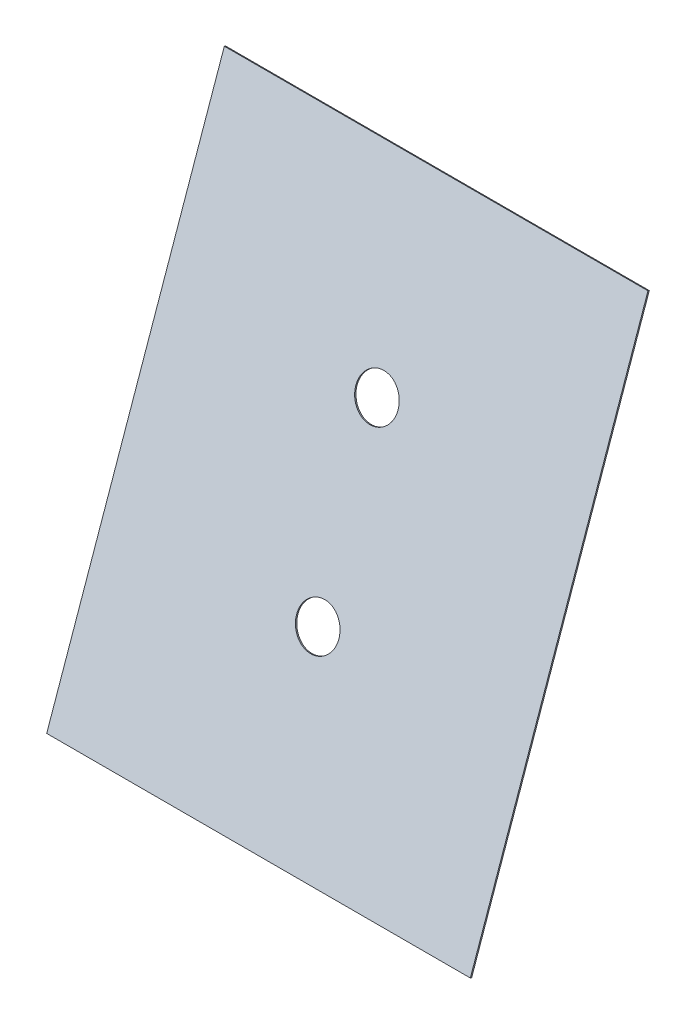
ISO-10303-21;
HEADER;
FILE_DESCRIPTION(('STEP AP214'),'2;1');
FILE_NAME('part.step','',(''),(''),'','','');
FILE_SCHEMA(('AUTOMOTIVE_DESIGN { 1 0 10303 214 1 1 1 1 }'));
ENDSEC;
DATA;
#1=APPLICATION_CONTEXT('core data for automotive mechanical design processes');
#2=APPLICATION_PROTOCOL_DEFINITION('international standard','automotive_design',2000,#1);
#3=PRODUCT_CONTEXT('',#1,'mechanical');
#4=PRODUCT('Part','Part','',(#3));
#5=PRODUCT_RELATED_PRODUCT_CATEGORY('part','',(#4));
#6=PRODUCT_DEFINITION_FORMATION('','',#4);
#7=PRODUCT_DEFINITION_CONTEXT('part definition',#1,'design');
#8=PRODUCT_DEFINITION('design','',#6,#7);
#9=PRODUCT_DEFINITION_SHAPE('','',#8);
#10=(LENGTH_UNIT() NAMED_UNIT(*) SI_UNIT(.MILLI.,.METRE.));
#11=(NAMED_UNIT(*) PLANE_ANGLE_UNIT() SI_UNIT($,.RADIAN.));
#12=(NAMED_UNIT(*) SI_UNIT($,.STERADIAN.) SOLID_ANGLE_UNIT());
#13=UNCERTAINTY_MEASURE_WITH_UNIT(LENGTH_MEASURE(1.E-05),#10,'distance_accuracy_value','');
#14=(GEOMETRIC_REPRESENTATION_CONTEXT(3) GLOBAL_UNCERTAINTY_ASSIGNED_CONTEXT((#13)) GLOBAL_UNIT_ASSIGNED_CONTEXT((#10,
#11,#12)) REPRESENTATION_CONTEXT('',''));
#15=CARTESIAN_POINT('',(0.,0.,0.));
#16=DIRECTION('',(0.,0.,1.));
#17=DIRECTION('',(1.,0.,0.));
#18=AXIS2_PLACEMENT_3D('',#15,#16,#17);
#19=CARTESIAN_POINT('',(0.,41.911392989595,27.0878631229525));
#20=DIRECTION('',(-1.,0.,0.));
#21=DIRECTION('',(0.,-0.943605153347606,0.331072974698691));
#22=AXIS2_PLACEMENT_3D('',#19,#20,#21);
#23=PLANE('',#22);
#24=DIRECTION('',(0.,0.331072974698691,0.943605153347606));
#25=VECTOR('',#24,1.);
#26=CARTESIAN_POINT('',(0.,41.911392989595,27.0878631229525));
#27=LINE('',#26,#25);
#28=CARTESIAN_POINT('',(0.,41.8782856921251,26.9935026076177));
#29=VERTEX_POINT('',#28);
#30=CARTESIAN_POINT('',(0.,41.911392989595,27.0878631229525));
#31=VERTEX_POINT('',#30);
#32=EDGE_CURVE('E11',#29,#31,#27,.T.);
#33=ORIENTED_EDGE('',*,*,#32,.F.);
#34=DIRECTION('',(0.,-0.943605153347606,0.331072974698691));
#35=VECTOR('',#34,1.);
#36=CARTESIAN_POINT('',(0.,41.8782856921251,26.9935026076177));
#37=LINE('',#36,#35);
#38=CARTESIAN_POINT('',(0.,6.02439396359544,39.573186543189));
#39=VERTEX_POINT('',#38);
#40=EDGE_CURVE('E88',#29,#39,#37,.T.);
#41=ORIENTED_EDGE('',*,*,#40,.T.);
#42=DIRECTION('',(0.,0.331072974698691,0.943605153347606));
#43=VECTOR('',#42,1.);
#44=CARTESIAN_POINT('',(0.,6.0575012610653,39.6675470585237));
#45=LINE('',#44,#43);
#46=CARTESIAN_POINT('',(0.,6.0575012610653,39.6675470585237));
#47=VERTEX_POINT('',#46);
#48=EDGE_CURVE('E43',#39,#47,#45,.T.);
#49=ORIENTED_EDGE('',*,*,#48,.T.);
#50=DIRECTION('',(0.,-0.943605153347606,0.331072974698691));
#51=VECTOR('',#50,1.);
#52=CARTESIAN_POINT('',(0.,41.911392989595,27.0878631229525));
#53=LINE('',#52,#51);
#54=EDGE_CURVE('E105',#31,#47,#53,.T.);
#55=ORIENTED_EDGE('',*,*,#54,.F.);
#56=EDGE_LOOP('',(#33,#41,#49,#55));
#57=FACE_BOUND('',#56,.T.);
#58=ADVANCED_FACE('F33',(#57),#23,.T.);
#59=CARTESIAN_POINT('',(0.,6.0575012610653,39.6675470585237));
#60=DIRECTION('',(0.,-0.943605153347606,0.331072974698691));
#61=DIRECTION('',(1.,0.,0.));
#62=AXIS2_PLACEMENT_3D('',#59,#60,#61);
#63=PLANE('',#62);
#64=ORIENTED_EDGE('',*,*,#48,.F.);
#65=DIRECTION('',(1.,0.,0.));
#66=VECTOR('',#65,1.);
#67=CARTESIAN_POINT('',(0.,6.02439396359544,39.573186543189));
#68=LINE('',#67,#66);
#69=CARTESIAN_POINT('',(30.,6.02439396359544,39.573186543189));
#70=VERTEX_POINT('',#69);
#71=EDGE_CURVE('E99',#39,#70,#68,.T.);
#72=ORIENTED_EDGE('',*,*,#71,.T.);
#73=DIRECTION('',(0.,0.331072974698691,0.943605153347606));
#74=VECTOR('',#73,1.);
#75=CARTESIAN_POINT('',(30.,6.0575012610653,39.6675470585237));
#76=LINE('',#75,#74);
#77=CARTESIAN_POINT('',(30.,6.0575012610653,39.6675470585237));
#78=VERTEX_POINT('',#77);
#79=EDGE_CURVE('E51',#70,#78,#76,.T.);
#80=ORIENTED_EDGE('',*,*,#79,.T.);
#81=DIRECTION('',(1.,0.,0.));
#82=VECTOR('',#81,1.);
#83=CARTESIAN_POINT('',(0.,6.0575012610653,39.6675470585237));
#84=LINE('',#83,#82);
#85=EDGE_CURVE('E82',#47,#78,#84,.T.);
#86=ORIENTED_EDGE('',*,*,#85,.F.);
#87=EDGE_LOOP('',(#64,#72,#80,#86));
#88=FACE_BOUND('',#87,.T.);
#89=ADVANCED_FACE('F109',(#88),#63,.T.);
#90=CARTESIAN_POINT('',(30.,41.911392989595,27.0878631229525));
#91=DIRECTION('',(-1.,0.,0.));
#92=DIRECTION('',(0.,-0.943605153347606,0.331072974698691));
#93=AXIS2_PLACEMENT_3D('',#90,#91,#92);
#94=PLANE('',#93);
#95=ORIENTED_EDGE('',*,*,#79,.F.);
#96=DIRECTION('',(0.,-0.943605153347606,0.331072974698691));
#97=VECTOR('',#96,1.);
#98=CARTESIAN_POINT('',(30.,41.8782856921251,26.9935026076177));
#99=LINE('',#98,#97);
#100=CARTESIAN_POINT('',(30.,41.8782856921251,26.9935026076177));
#101=VERTEX_POINT('',#100);
#102=EDGE_CURVE('E87',#101,#70,#99,.T.);
#103=ORIENTED_EDGE('',*,*,#102,.F.);
#104=DIRECTION('',(0.,0.331072974698691,0.943605153347606));
#105=VECTOR('',#104,1.);
#106=CARTESIAN_POINT('',(30.,41.911392989595,27.0878631229525));
#107=LINE('',#106,#105);
#108=CARTESIAN_POINT('',(30.,41.911392989595,27.0878631229525));
#109=VERTEX_POINT('',#108);
#110=EDGE_CURVE('E37',#101,#109,#107,.T.);
#111=ORIENTED_EDGE('',*,*,#110,.T.);
#112=DIRECTION('',(0.,-0.943605153347606,0.331072974698691));
#113=VECTOR('',#112,1.);
#114=CARTESIAN_POINT('',(30.,41.911392989595,27.0878631229525));
#115=LINE('',#114,#113);
#116=EDGE_CURVE('E101',#109,#78,#115,.T.);
#117=ORIENTED_EDGE('',*,*,#116,.T.);
#118=EDGE_LOOP('',(#95,#103,#111,#117));
#119=FACE_BOUND('',#118,.T.);
#120=ADVANCED_FACE('F90',(#119),#94,.F.);
#121=CARTESIAN_POINT('',(0.,41.911392989595,27.0878631229525));
#122=DIRECTION('',(0.,-0.943605153347606,0.331072974698691));
#123=DIRECTION('',(1.,0.,0.));
#124=AXIS2_PLACEMENT_3D('',#121,#122,#123);
#125=PLANE('',#124);
#126=DIRECTION('',(1.,0.,0.));
#127=VECTOR('',#126,1.);
#128=CARTESIAN_POINT('',(0.,41.8782856921251,26.9935026076177));
#129=LINE('',#128,#127);
#130=EDGE_CURVE('E76',#29,#101,#129,.T.);
#131=ORIENTED_EDGE('',*,*,#130,.F.);
#132=ORIENTED_EDGE('',*,*,#32,.T.);
#133=DIRECTION('',(1.,0.,0.));
#134=VECTOR('',#133,1.);
#135=CARTESIAN_POINT('',(0.,41.911392989595,27.0878631229525));
#136=LINE('',#135,#134);
#137=EDGE_CURVE('E78',#31,#109,#136,.T.);
#138=ORIENTED_EDGE('',*,*,#137,.T.);
#139=ORIENTED_EDGE('',*,*,#110,.F.);
#140=EDGE_LOOP('',(#131,#132,#138,#139));
#141=FACE_BOUND('',#140,.T.);
#142=ADVANCED_FACE('F35',(#141),#125,.F.);
#143=CARTESIAN_POINT('',(0.,41.911392989595,27.0878631229525));
#144=DIRECTION('',(0.,0.331072974698691,0.943605153347606));
#145=DIRECTION('',(0.,-0.943605153347606,0.331072974698691));
#146=AXIS2_PLACEMENT_3D('',#143,#144,#145);
#147=PLANE('',#146);
#148=CARTESIAN_POINT('',(15.,29.9600957467518,31.2810911014762));
#149=DIRECTION('',(0.,0.331072974698691,0.943605153347606));
#150=DIRECTION('',(0.,-0.943605153347606,0.331072974698691));
#151=AXIS2_PLACEMENT_3D('',#148,#149,#150);
#152=CIRCLE('',#151,1.5);
#153=CARTESIAN_POINT('',(15.,31.3755034767732,30.7844816394282));
#154=VERTEX_POINT('',#153);
#155=EDGE_CURVE('E94',#154,#154,#152,.F.);
#156=ORIENTED_EDGE('',*,*,#155,.T.);
#157=EDGE_LOOP('',(#156));
#158=FACE_BOUND('',#157,.T.);
#159=CARTESIAN_POINT('',(15.,18.0087985039085,35.47431908));
#160=DIRECTION('',(0.,0.331072974698691,0.943605153347606));
#161=DIRECTION('',(0.,-0.943605153347606,0.331072974698691));
#162=AXIS2_PLACEMENT_3D('',#159,#160,#161);
#163=CIRCLE('',#162,1.5);
#164=CARTESIAN_POINT('',(15.,19.42420623393,34.9777096179519));
#165=VERTEX_POINT('',#164);
#166=EDGE_CURVE('E113',#165,#165,#163,.F.);
#167=ORIENTED_EDGE('',*,*,#166,.T.);
#168=EDGE_LOOP('',(#167));
#169=FACE_BOUND('',#168,.T.);
#170=ORIENTED_EDGE('',*,*,#116,.F.);
#171=ORIENTED_EDGE('',*,*,#137,.F.);
#172=ORIENTED_EDGE('',*,*,#54,.T.);
#173=ORIENTED_EDGE('',*,*,#85,.T.);
#174=EDGE_LOOP('',(#170,#171,#172,#173));
#175=FACE_BOUND('',#174,.T.);
#176=ADVANCED_FACE('F108',(#158,#169,#175),#147,.T.);
#177=CARTESIAN_POINT('',(0.,41.8782856921251,26.9935026076177));
#178=DIRECTION('',(0.,0.331072974698691,0.943605153347606));
#179=DIRECTION('',(0.,-0.943605153347606,0.331072974698691));
#180=AXIS2_PLACEMENT_3D('',#177,#178,#179);
#181=PLANE('',#180);
#182=CARTESIAN_POINT('',(15.,29.9269884492819,31.1867305861415));
#183=DIRECTION('',(0.,-0.331072974698692,-0.943605153347606));
#184=DIRECTION('',(0.,0.943605153347606,-0.331072974698692));
#185=AXIS2_PLACEMENT_3D('',#182,#183,#184);
#186=CIRCLE('',#185,1.5);
#187=CARTESIAN_POINT('',(15.,31.3423961793033,30.6901211240934));
#188=VERTEX_POINT('',#187);
#189=EDGE_CURVE('E91',#188,#188,#186,.T.);
#190=ORIENTED_EDGE('',*,*,#189,.F.);
#191=EDGE_LOOP('',(#190));
#192=FACE_BOUND('',#191,.T.);
#193=CARTESIAN_POINT('',(15.,17.9756912064387,35.3799585646652));
#194=DIRECTION('',(0.,-0.331072974698692,-0.943605153347606));
#195=DIRECTION('',(0.,0.943605153347606,-0.331072974698692));
#196=AXIS2_PLACEMENT_3D('',#193,#194,#195);
#197=CIRCLE('',#196,1.5);
#198=CARTESIAN_POINT('',(15.,19.3910989364601,34.8833491026172));
#199=VERTEX_POINT('',#198);
#200=EDGE_CURVE('E116',#199,#199,#197,.T.);
#201=ORIENTED_EDGE('',*,*,#200,.F.);
#202=EDGE_LOOP('',(#201));
#203=FACE_BOUND('',#202,.T.);
#204=ORIENTED_EDGE('',*,*,#102,.T.);
#205=ORIENTED_EDGE('',*,*,#71,.F.);
#206=ORIENTED_EDGE('',*,*,#40,.F.);
#207=ORIENTED_EDGE('',*,*,#130,.T.);
#208=EDGE_LOOP('',(#204,#205,#206,#207));
#209=FACE_BOUND('',#208,.T.);
#210=ADVANCED_FACE('F85',(#192,#203,#209),#181,.F.);
#211=CARTESIAN_POINT('',(15.,32.7515997376299,77.4934033365135));
#212=DIRECTION('',(0.,-0.331072974698692,-0.943605153347606));
#213=DIRECTION('',(0.,0.943605153347606,-0.331072974698692));
#214=AXIS2_PLACEMENT_3D('',#211,#212,#213);
#215=CYLINDRICAL_SURFACE('',#214,1.5);
#216=CARTESIAN_POINT('',(15.,19.42420623393,34.9777096179519));
#217=CARTESIAN_POINT('',(15.,19.423861366248,34.9767266959172));
#218=CARTESIAN_POINT('',(15.,19.423516498566,34.9757437738825));
#219=CARTESIAN_POINT('',(15.,19.422826763202,34.973777929813));
#220=CARTESIAN_POINT('',(15.,19.4224818955201,34.9727950077783));
#221=CARTESIAN_POINT('',(15.,19.4217921601561,34.9708291637088));
#222=CARTESIAN_POINT('',(15.,19.4214472924741,34.969846241674));
#223=CARTESIAN_POINT('',(15.,19.4207575571102,34.9678803976046));
#224=CARTESIAN_POINT('',(15.,19.4204126894282,34.9668974755698));
#225=CARTESIAN_POINT('',(15.,19.4197229540642,34.9649316315004));
#226=CARTESIAN_POINT('',(15.,19.4193780863823,34.9639487094656));
#227=CARTESIAN_POINT('',(15.,19.4186883510183,34.9619828653961));
#228=CARTESIAN_POINT('',(15.,19.4183434833363,34.9609999433614));
#229=CARTESIAN_POINT('',(15.,19.4176537479724,34.9590340992919));
#230=CARTESIAN_POINT('',(15.,19.4173088802904,34.9580511772572));
#231=CARTESIAN_POINT('',(15.,19.4166191449264,34.9560853331877));
#232=CARTESIAN_POINT('',(15.,19.4162742772445,34.955102411153));
#233=CARTESIAN_POINT('',(15.,19.4155845418805,34.9531365670835));
#234=CARTESIAN_POINT('',(15.,19.4152396741985,34.9521536450488));
#235=CARTESIAN_POINT('',(15.,19.4145499388346,34.9501878009793));
#236=CARTESIAN_POINT('',(15.,19.4142050711526,34.9492048789446));
#237=CARTESIAN_POINT('',(15.,19.4135153357886,34.9472390348751));
#238=CARTESIAN_POINT('',(15.,19.4131704681067,34.9462561128404));
#239=CARTESIAN_POINT('',(15.,19.4124807327427,34.9442902687709));
#240=CARTESIAN_POINT('',(15.,19.4121358650607,34.9433073467361));
#241=CARTESIAN_POINT('',(15.,19.4114461296968,34.9413415026667));
#242=CARTESIAN_POINT('',(15.,19.4111012620148,34.9403585806319));
#243=CARTESIAN_POINT('',(15.,19.4104115266508,34.9383927365625));
#244=CARTESIAN_POINT('',(15.,19.4100666589689,34.9374098145277));
#245=CARTESIAN_POINT('',(15.,19.4093769236049,34.9354439704582));
#246=CARTESIAN_POINT('',(15.,19.4090320559229,34.9344610484235));
#247=CARTESIAN_POINT('',(15.,19.408342320559,34.932495204354));
#248=CARTESIAN_POINT('',(15.,19.407997452877,34.9315122823193));
#249=CARTESIAN_POINT('',(15.,19.407307717513,34.9295464382498));
#250=CARTESIAN_POINT('',(15.,19.4069628498311,34.9285635162151));
#251=CARTESIAN_POINT('',(15.,19.4062731144671,34.9265976721456));
#252=CARTESIAN_POINT('',(15.,19.4059282467851,34.9256147501109));
#253=CARTESIAN_POINT('',(15.,19.4052385114212,34.9236489060414));
#254=CARTESIAN_POINT('',(15.,19.4048936437392,34.9226659840067));
#255=CARTESIAN_POINT('',(15.,19.4042039083752,34.9207001399372));
#256=CARTESIAN_POINT('',(15.,19.4038590406933,34.9197172179025));
#257=CARTESIAN_POINT('',(15.,19.4031693053293,34.917751373833));
#258=CARTESIAN_POINT('',(15.,19.4028244376473,34.9167684517982));
#259=CARTESIAN_POINT('',(15.,19.4021347022834,34.9148026077288));
#260=CARTESIAN_POINT('',(15.,19.4017898346014,34.913819685694));
#261=CARTESIAN_POINT('',(15.,19.4011000992374,34.9118538416246));
#262=CARTESIAN_POINT('',(15.,19.4007552315555,34.9108709195898));
#263=CARTESIAN_POINT('',(15.,19.4000654961915,34.9089050755203));
#264=CARTESIAN_POINT('',(15.,19.3997206285095,34.9079221534856));
#265=CARTESIAN_POINT('',(15.,19.3990308931456,34.9059563094161));
#266=CARTESIAN_POINT('',(15.,19.3986860254636,34.9049733873814));
#267=CARTESIAN_POINT('',(15.,19.3979962900996,34.9030075433119));
#268=CARTESIAN_POINT('',(15.,19.3976514224177,34.9020246212772));
#269=CARTESIAN_POINT('',(15.,19.3969616870537,34.9000587772077));
#270=CARTESIAN_POINT('',(15.,19.3966168193717,34.899075855173));
#271=CARTESIAN_POINT('',(15.,19.3959270840078,34.8971100111035));
#272=CARTESIAN_POINT('',(15.,19.3955822163258,34.8961270890688));
#273=CARTESIAN_POINT('',(15.,19.3948924809618,34.8941612449993));
#274=CARTESIAN_POINT('',(15.,19.3945476132799,34.8931783229645));
#275=CARTESIAN_POINT('',(15.,19.3938578779159,34.8912124788951));
#276=CARTESIAN_POINT('',(15.,19.3935130102339,34.8902295568603));
#277=CARTESIAN_POINT('',(15.,19.39282327487,34.8882637127909));
#278=CARTESIAN_POINT('',(15.,19.392478407188,34.8872807907561));
#279=CARTESIAN_POINT('',(15.,19.391788671824,34.8853149466867));
#280=CARTESIAN_POINT('',(15.,19.3914438041421,34.8843320246519));
#281=CARTESIAN_POINT('',(15.,19.3910989364601,34.8833491026172));
#282=B_SPLINE_CURVE_WITH_KNOTS('',3,(#216,#217,#218,#219,#220,#221,#222,#223,#224,#225,#226,
#227,#228,#229,#230,#231,#232,#233,#234,#235,#236,#237,#238,#239,#240,#241,#242,#243,#244,#245,
#246,#247,#248,#249,#250,#251,#252,#253,#254,#255,#256,#257,#258,#259,#260,#261,#262,#263,#264,
#265,#266,#267,#268,#269,#270,#271,#272,#273,#274,#275,#276,#277,#278,#279,#280,#281),
.UNSPECIFIED.,.F.,.F.,(4,2,2,2,2,2,2,2,2,2,2,2,2,2,2,2,2,2,2,2,2,2,2,2,2,2,2,2,2,2,2,2,4),(0.,
0.00312500000000028,0.00624999999999941,0.0093750000000051,0.0125000000000042,
0.0156250000000034,0.0187500000000025,0.0218750000000016,0.0250000000000008,0.0281250000000076,
0.0312500000000067,0.0343750000000059,0.037500000000005,0.0406250000000041,0.0437500000000033,
0.0468750000000035,0.0500000000000015,0.0531250000000018,0.0562500000000063,0.0593750000000066,
0.0625000000000046,0.0656250000000049,0.0687500000000029,0.0718750000000032,0.07500000000001,
0.078125000000008,0.0812500000000082,0.0843750000000062,0.0875000000000065,0.0906250000000056,
0.0937500000000048,0.0968750000000039,0.100000000000003),.UNSPECIFIED.);
#283=EDGE_CURVE('BSEAM127',#165,#199,#282,.T.);
#284=ORIENTED_EDGE('',*,*,#166,.F.);
#285=ORIENTED_EDGE('',*,*,#200,.T.);
#286=ORIENTED_EDGE('',*,*,#283,.T.);
#287=ORIENTED_EDGE('',*,*,#283,.F.);
#288=EDGE_LOOP('',(#284,#286,#285,#287));
#289=FACE_BOUND('',#288,.T.);
#290=ADVANCED_FACE('F127',(#289),#215,.F.);
#291=CARTESIAN_POINT('',(15.,44.7028969804731,73.3001753579898));
#292=DIRECTION('',(0.,-0.331072974698692,-0.943605153347606));
#293=DIRECTION('',(0.,0.943605153347606,-0.331072974698692));
#294=AXIS2_PLACEMENT_3D('',#291,#292,#293);
#295=CYLINDRICAL_SURFACE('',#294,1.5);
#296=CARTESIAN_POINT('',(15.,31.3755034767732,30.7844816394282));
#297=CARTESIAN_POINT('',(15.,31.3751586090912,30.7834987173934));
#298=CARTESIAN_POINT('',(15.,31.3748137414092,30.7825157953587));
#299=CARTESIAN_POINT('',(15.,31.3741240060453,30.7805499512892));
#300=CARTESIAN_POINT('',(15.,31.3737791383633,30.7795670292545));
#301=CARTESIAN_POINT('',(15.,31.3730894029993,30.777601185185));
#302=CARTESIAN_POINT('',(15.,31.3727445353174,30.7766182631503));
#303=CARTESIAN_POINT('',(15.,31.3720547999534,30.7746524190808));
#304=CARTESIAN_POINT('',(15.,31.3717099322714,30.7736694970461));
#305=CARTESIAN_POINT('',(15.,31.3710201969075,30.7717036529766));
#306=CARTESIAN_POINT('',(15.,31.3706753292255,30.7707207309419));
#307=CARTESIAN_POINT('',(15.,31.3699855938615,30.7687548868724));
#308=CARTESIAN_POINT('',(15.,31.3696407261796,30.7677719648376));
#309=CARTESIAN_POINT('',(15.,31.3689509908156,30.7658061207682));
#310=CARTESIAN_POINT('',(15.,31.3686061231336,30.7648231987334));
#311=CARTESIAN_POINT('',(15.,31.3679163877697,30.762857354664));
#312=CARTESIAN_POINT('',(15.,31.3675715200877,30.7618744326292));
#313=CARTESIAN_POINT('',(15.,31.3668817847237,30.7599085885598));
#314=CARTESIAN_POINT('',(15.,31.3665369170418,30.758925666525));
#315=CARTESIAN_POINT('',(15.,31.3658471816778,30.7569598224555));
#316=CARTESIAN_POINT('',(15.,31.3655023139958,30.7559769004208));
#317=CARTESIAN_POINT('',(15.,31.3648125786319,30.7540110563513));
#318=CARTESIAN_POINT('',(15.,31.3644677109499,30.7530281343166));
#319=CARTESIAN_POINT('',(15.,31.3637779755859,30.7510622902471));
#320=CARTESIAN_POINT('',(15.,31.363433107904,30.7500793682124));
#321=CARTESIAN_POINT('',(15.,31.36274337254,30.7481135241429));
#322=CARTESIAN_POINT('',(15.,31.362398504858,30.7471306021082));
#323=CARTESIAN_POINT('',(15.,31.3617087694941,30.7451647580387));
#324=CARTESIAN_POINT('',(15.,31.3613639018121,30.744181836004));
#325=CARTESIAN_POINT('',(15.,31.3606741664481,30.7422159919345));
#326=CARTESIAN_POINT('',(15.,31.3603292987662,30.7412330698997));
#327=CARTESIAN_POINT('',(15.,31.3596395634022,30.7392672258303));
#328=CARTESIAN_POINT('',(15.,31.3592946957202,30.7382843037955));
#329=CARTESIAN_POINT('',(15.,31.3586049603563,30.7363184597261));
#330=CARTESIAN_POINT('',(15.,31.3582600926743,30.7353355376913));
#331=CARTESIAN_POINT('',(15.,31.3575703573103,30.7333696936218));
#332=CARTESIAN_POINT('',(15.,31.3572254896284,30.7323867715871));
#333=CARTESIAN_POINT('',(15.,31.3565357542644,30.7304209275176));
#334=CARTESIAN_POINT('',(15.,31.3561908865824,30.7294380054829));
#335=CARTESIAN_POINT('',(15.,31.3555011512185,30.7274721614134));
#336=CARTESIAN_POINT('',(15.,31.3551562835365,30.7264892393787));
#337=CARTESIAN_POINT('',(15.,31.3544665481725,30.7245233953092));
#338=CARTESIAN_POINT('',(15.,31.3541216804906,30.7235404732745));
#339=CARTESIAN_POINT('',(15.,31.3534319451266,30.721574629205));
#340=CARTESIAN_POINT('',(15.,31.3530870774446,30.7205917071703));
#341=CARTESIAN_POINT('',(15.,31.3523973420807,30.7186258631008));
#342=CARTESIAN_POINT('',(15.,31.3520524743987,30.717642941066));
#343=CARTESIAN_POINT('',(15.,31.3513627390347,30.7156770969966));
#344=CARTESIAN_POINT('',(15.,31.3510178713528,30.7146941749618));
#345=CARTESIAN_POINT('',(15.,31.3503281359888,30.7127283308924));
#346=CARTESIAN_POINT('',(15.,31.3499832683068,30.7117454088576));
#347=CARTESIAN_POINT('',(15.,31.3492935329429,30.7097795647882));
#348=CARTESIAN_POINT('',(15.,31.3489486652609,30.7087966427534));
#349=CARTESIAN_POINT('',(15.,31.3482589298969,30.7068307986839));
#350=CARTESIAN_POINT('',(15.,31.347914062215,30.7058478766492));
#351=CARTESIAN_POINT('',(15.,31.347224326851,30.7038820325797));
#352=CARTESIAN_POINT('',(15.,31.346879459169,30.702899110545));
#353=CARTESIAN_POINT('',(15.,31.3461897238051,30.7009332664755));
#354=CARTESIAN_POINT('',(15.,31.3458448561231,30.6999503444408));
#355=CARTESIAN_POINT('',(15.,31.3451551207591,30.6979845003713));
#356=CARTESIAN_POINT('',(15.,31.3448102530771,30.6970015783366));
#357=CARTESIAN_POINT('',(15.,31.3441205177132,30.6950357342671));
#358=CARTESIAN_POINT('',(15.,31.3437756500312,30.6940528122324));
#359=CARTESIAN_POINT('',(15.,31.3430859146673,30.6920869681629));
#360=CARTESIAN_POINT('',(15.,31.3427410469853,30.6911040461281));
#361=CARTESIAN_POINT('',(15.,31.3423961793033,30.6901211240934));
#362=B_SPLINE_CURVE_WITH_KNOTS('',3,(#296,#297,#298,#299,#300,#301,#302,#303,#304,#305,#306,
#307,#308,#309,#310,#311,#312,#313,#314,#315,#316,#317,#318,#319,#320,#321,#322,#323,#324,#325,
#326,#327,#328,#329,#330,#331,#332,#333,#334,#335,#336,#337,#338,#339,#340,#341,#342,#343,#344,
#345,#346,#347,#348,#349,#350,#351,#352,#353,#354,#355,#356,#357,#358,#359,#360,#361),
.UNSPECIFIED.,.F.,.F.,(4,2,2,2,2,2,2,2,2,2,2,2,2,2,2,2,2,2,2,2,2,2,2,2,2,2,2,2,2,2,2,2,4),(0.,
0.00312500000000453,0.00625000000000481,0.0093750000000028,0.0125000000000031,
0.0156250000000099,0.0187500000000079,0.0218750000000082,0.0250000000000062,0.0281250000000064,
0.0312500000000044,0.0343750000000047,0.0375000000000115,0.0406250000000095,0.0437500000000098,
0.0468750000000078,0.0500000000000081,0.0531250000000126,0.0562500000000129,0.0593750000000132,
0.0625000000000111,0.065625000000018,0.068750000000016,0.0718750000000162,0.0750000000000142,
0.0781250000000145,0.0812500000000148,0.0843750000000128,0.0875000000000196,0.0906250000000199,
0.0937500000000179,0.0968750000000159,0.100000000000016),.UNSPECIFIED.);
#363=EDGE_CURVE('BSEAM124',#154,#188,#362,.T.);
#364=ORIENTED_EDGE('',*,*,#155,.F.);
#365=ORIENTED_EDGE('',*,*,#189,.T.);
#366=ORIENTED_EDGE('',*,*,#363,.T.);
#367=ORIENTED_EDGE('',*,*,#363,.F.);
#368=EDGE_LOOP('',(#364,#366,#365,#367));
#369=FACE_BOUND('',#368,.T.);
#370=ADVANCED_FACE('F124',(#369),#295,.F.);
#371=CLOSED_SHELL('',(#58,#89,#120,#142,#176,#210,#290,#370));
#372=MANIFOLD_SOLID_BREP('B2',#371);
#373=ADVANCED_BREP_SHAPE_REPRESENTATION('',(#18,#372),#14);
#374=SHAPE_DEFINITION_REPRESENTATION(#9,#373);
ENDSEC;
END-ISO-10303-21;
